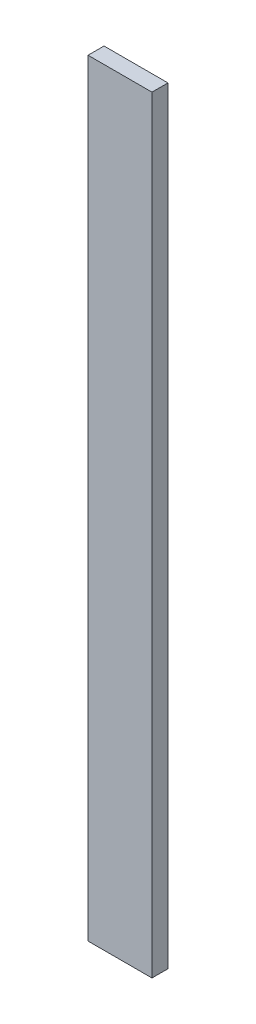
ISO-10303-21;
HEADER;
FILE_DESCRIPTION(('STEP AP214'),'2;1');
FILE_NAME('part.step','',(''),(''),'','','');
FILE_SCHEMA(('AUTOMOTIVE_DESIGN { 1 0 10303 214 1 1 1 1 }'));
ENDSEC;
DATA;
#1=APPLICATION_CONTEXT('core data for automotive mechanical design processes');
#2=APPLICATION_PROTOCOL_DEFINITION('international standard','automotive_design',2000,#1);
#3=PRODUCT_CONTEXT('',#1,'mechanical');
#4=PRODUCT('Part','Part','',(#3));
#5=PRODUCT_RELATED_PRODUCT_CATEGORY('part','',(#4));
#6=PRODUCT_DEFINITION_FORMATION('','',#4);
#7=PRODUCT_DEFINITION_CONTEXT('part definition',#1,'design');
#8=PRODUCT_DEFINITION('design','',#6,#7);
#9=PRODUCT_DEFINITION_SHAPE('','',#8);
#10=(LENGTH_UNIT() NAMED_UNIT(*) SI_UNIT(.MILLI.,.METRE.));
#11=(NAMED_UNIT(*) PLANE_ANGLE_UNIT() SI_UNIT($,.RADIAN.));
#12=(NAMED_UNIT(*) SI_UNIT($,.STERADIAN.) SOLID_ANGLE_UNIT());
#13=UNCERTAINTY_MEASURE_WITH_UNIT(LENGTH_MEASURE(1.E-05),#10,'distance_accuracy_value','');
#14=(GEOMETRIC_REPRESENTATION_CONTEXT(3) GLOBAL_UNCERTAINTY_ASSIGNED_CONTEXT((#13)) GLOBAL_UNIT_ASSIGNED_CONTEXT((#10,
#11,#12)) REPRESENTATION_CONTEXT('',''));
#15=CARTESIAN_POINT('',(0.,0.,0.));
#16=DIRECTION('',(0.,0.,1.));
#17=DIRECTION('',(1.,0.,0.));
#18=AXIS2_PLACEMENT_3D('',#15,#16,#17);
#19=CARTESIAN_POINT('',(12.7,152.4,6.35));
#20=DIRECTION('',(-1.,0.,0.));
#21=DIRECTION('',(0.,-1.,0.));
#22=AXIS2_PLACEMENT_3D('',#19,#20,#21);
#23=PLANE('',#22);
#24=DIRECTION('',(0.,1.,0.));
#25=VECTOR('',#24,1.);
#26=CARTESIAN_POINT('',(12.7,152.4,0.));
#27=LINE('',#26,#25);
#28=CARTESIAN_POINT('',(12.7,-152.4,0.));
#29=VERTEX_POINT('',#28);
#30=CARTESIAN_POINT('',(12.7,152.4,0.));
#31=VERTEX_POINT('',#30);
#32=EDGE_CURVE('E100',#29,#31,#27,.T.);
#33=ORIENTED_EDGE('',*,*,#32,.T.);
#34=DIRECTION('',(0.,0.,-1.));
#35=VECTOR('',#34,1.);
#36=CARTESIAN_POINT('',(12.7,152.4,6.35));
#37=LINE('',#36,#35);
#38=CARTESIAN_POINT('',(12.7,152.4,6.35));
#39=VERTEX_POINT('',#38);
#40=EDGE_CURVE('E11',#39,#31,#37,.T.);
#41=ORIENTED_EDGE('',*,*,#40,.F.);
#42=DIRECTION('',(0.,1.,0.));
#43=VECTOR('',#42,1.);
#44=CARTESIAN_POINT('',(12.7,152.4,6.35));
#45=LINE('',#44,#43);
#46=CARTESIAN_POINT('',(12.7,-152.4,6.35));
#47=VERTEX_POINT('',#46);
#48=EDGE_CURVE('E88',#47,#39,#45,.T.);
#49=ORIENTED_EDGE('',*,*,#48,.F.);
#50=DIRECTION('',(0.,0.,-1.));
#51=VECTOR('',#50,1.);
#52=CARTESIAN_POINT('',(12.7,-152.4,6.35));
#53=LINE('',#52,#51);
#54=EDGE_CURVE('E96',#47,#29,#53,.T.);
#55=ORIENTED_EDGE('',*,*,#54,.T.);
#56=EDGE_LOOP('',(#33,#41,#49,#55));
#57=FACE_BOUND('',#56,.T.);
#58=ADVANCED_FACE('F37',(#57),#23,.F.);
#59=CARTESIAN_POINT('',(-12.7,152.4,6.35));
#60=DIRECTION('',(0.,-1.,0.));
#61=DIRECTION('',(0.,0.,-1.));
#62=AXIS2_PLACEMENT_3D('',#59,#60,#61);
#63=PLANE('',#62);
#64=DIRECTION('',(-1.,0.,0.));
#65=VECTOR('',#64,1.);
#66=CARTESIAN_POINT('',(-12.7,152.4,0.));
#67=LINE('',#66,#65);
#68=CARTESIAN_POINT('',(-12.7,152.4,0.));
#69=VERTEX_POINT('',#68);
#70=EDGE_CURVE('E92',#31,#69,#67,.T.);
#71=ORIENTED_EDGE('',*,*,#70,.T.);
#72=DIRECTION('',(0.,0.,-1.));
#73=VECTOR('',#72,1.);
#74=CARTESIAN_POINT('',(-12.7,152.4,6.35));
#75=LINE('',#74,#73);
#76=CARTESIAN_POINT('',(-12.7,152.4,6.35));
#77=VERTEX_POINT('',#76);
#78=EDGE_CURVE('E45',#77,#69,#75,.T.);
#79=ORIENTED_EDGE('',*,*,#78,.F.);
#80=DIRECTION('',(-1.,0.,0.));
#81=VECTOR('',#80,1.);
#82=CARTESIAN_POINT('',(-12.7,152.4,6.35));
#83=LINE('',#82,#81);
#84=EDGE_CURVE('E83',#39,#77,#83,.T.);
#85=ORIENTED_EDGE('',*,*,#84,.F.);
#86=ORIENTED_EDGE('',*,*,#40,.T.);
#87=EDGE_LOOP('',(#71,#79,#85,#86));
#88=FACE_BOUND('',#87,.T.);
#89=ADVANCED_FACE('F91',(#88),#63,.F.);
#90=CARTESIAN_POINT('',(-12.7,152.4,6.35));
#91=DIRECTION('',(1.,0.,0.));
#92=DIRECTION('',(0.,1.,0.));
#93=AXIS2_PLACEMENT_3D('',#90,#91,#92);
#94=PLANE('',#93);
#95=DIRECTION('',(0.,-1.,0.));
#96=VECTOR('',#95,1.);
#97=CARTESIAN_POINT('',(-12.7,152.4,0.));
#98=LINE('',#97,#96);
#99=CARTESIAN_POINT('',(-12.7,-152.4,0.));
#100=VERTEX_POINT('',#99);
#101=EDGE_CURVE('E70',#69,#100,#98,.T.);
#102=ORIENTED_EDGE('',*,*,#101,.T.);
#103=DIRECTION('',(0.,0.,-1.));
#104=VECTOR('',#103,1.);
#105=CARTESIAN_POINT('',(-12.7,-152.4,6.35));
#106=LINE('',#105,#104);
#107=CARTESIAN_POINT('',(-12.7,-152.4,6.35));
#108=VERTEX_POINT('',#107);
#109=EDGE_CURVE('E93',#108,#100,#106,.T.);
#110=ORIENTED_EDGE('',*,*,#109,.F.);
#111=DIRECTION('',(0.,-1.,0.));
#112=VECTOR('',#111,1.);
#113=CARTESIAN_POINT('',(-12.7,152.4,6.35));
#114=LINE('',#113,#112);
#115=EDGE_CURVE('E86',#77,#108,#114,.T.);
#116=ORIENTED_EDGE('',*,*,#115,.F.);
#117=ORIENTED_EDGE('',*,*,#78,.T.);
#118=EDGE_LOOP('',(#102,#110,#116,#117));
#119=FACE_BOUND('',#118,.T.);
#120=ADVANCED_FACE('F94',(#119),#94,.F.);
#121=CARTESIAN_POINT('',(-12.7,-152.4,6.35));
#122=DIRECTION('',(0.,1.,0.));
#123=DIRECTION('',(0.,0.,1.));
#124=AXIS2_PLACEMENT_3D('',#121,#122,#123);
#125=PLANE('',#124);
#126=DIRECTION('',(1.,0.,0.));
#127=VECTOR('',#126,1.);
#128=CARTESIAN_POINT('',(-12.7,-152.4,0.));
#129=LINE('',#128,#127);
#130=EDGE_CURVE('E76',#100,#29,#129,.T.);
#131=ORIENTED_EDGE('',*,*,#130,.T.);
#132=ORIENTED_EDGE('',*,*,#54,.F.);
#133=DIRECTION('',(1.,0.,0.));
#134=VECTOR('',#133,1.);
#135=CARTESIAN_POINT('',(-12.7,-152.4,6.35));
#136=LINE('',#135,#134);
#137=EDGE_CURVE('E53',#108,#47,#136,.T.);
#138=ORIENTED_EDGE('',*,*,#137,.F.);
#139=ORIENTED_EDGE('',*,*,#109,.T.);
#140=EDGE_LOOP('',(#131,#132,#138,#139));
#141=FACE_BOUND('',#140,.T.);
#142=ADVANCED_FACE('F107',(#141),#125,.F.);
#143=CARTESIAN_POINT('',(0.,0.,6.35));
#144=DIRECTION('',(0.,0.,1.));
#145=DIRECTION('',(1.,0.,0.));
#146=AXIS2_PLACEMENT_3D('',#143,#144,#145);
#147=PLANE('',#146);
#148=ORIENTED_EDGE('',*,*,#48,.T.);
#149=ORIENTED_EDGE('',*,*,#84,.T.);
#150=ORIENTED_EDGE('',*,*,#115,.T.);
#151=ORIENTED_EDGE('',*,*,#137,.T.);
#152=EDGE_LOOP('',(#148,#149,#150,#151));
#153=FACE_BOUND('',#152,.T.);
#154=ADVANCED_FACE('F84',(#153),#147,.T.);
#155=CARTESIAN_POINT('',(0.,0.,0.));
#156=DIRECTION('',(0.,0.,1.));
#157=DIRECTION('',(1.,0.,0.));
#158=AXIS2_PLACEMENT_3D('',#155,#156,#157);
#159=PLANE('',#158);
#160=ORIENTED_EDGE('',*,*,#32,.F.);
#161=ORIENTED_EDGE('',*,*,#130,.F.);
#162=ORIENTED_EDGE('',*,*,#101,.F.);
#163=ORIENTED_EDGE('',*,*,#70,.F.);
#164=EDGE_LOOP('',(#160,#161,#162,#163));
#165=FACE_BOUND('',#164,.T.);
#166=ADVANCED_FACE('F110',(#165),#159,.F.);
#167=CLOSED_SHELL('',(#58,#89,#120,#142,#154,#166));
#168=MANIFOLD_SOLID_BREP('B2',#167);
#169=ADVANCED_BREP_SHAPE_REPRESENTATION('',(#18,#168),#14);
#170=SHAPE_DEFINITION_REPRESENTATION(#9,#169);
ENDSEC;
END-ISO-10303-21;
